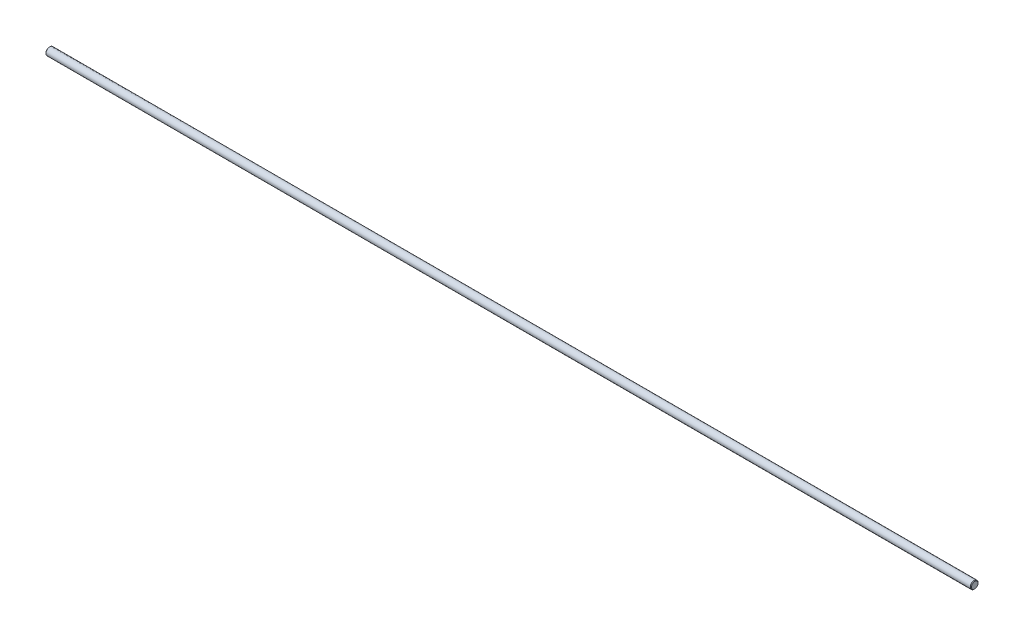
ISO-10303-21;
HEADER;
FILE_DESCRIPTION(('STEP AP214'),'2;1');
FILE_NAME('part.step','',(''),(''),'','','');
FILE_SCHEMA(('AUTOMOTIVE_DESIGN { 1 0 10303 214 1 1 1 1 }'));
ENDSEC;
DATA;
#1=APPLICATION_CONTEXT('core data for automotive mechanical design processes');
#2=APPLICATION_PROTOCOL_DEFINITION('international standard','automotive_design',2000,#1);
#3=PRODUCT_CONTEXT('',#1,'mechanical');
#4=PRODUCT('Part','Part','',(#3));
#5=PRODUCT_RELATED_PRODUCT_CATEGORY('part','',(#4));
#6=PRODUCT_DEFINITION_FORMATION('','',#4);
#7=PRODUCT_DEFINITION_CONTEXT('part definition',#1,'design');
#8=PRODUCT_DEFINITION('design','',#6,#7);
#9=PRODUCT_DEFINITION_SHAPE('','',#8);
#10=(LENGTH_UNIT() NAMED_UNIT(*) SI_UNIT(.MILLI.,.METRE.));
#11=(NAMED_UNIT(*) PLANE_ANGLE_UNIT() SI_UNIT($,.RADIAN.));
#12=(NAMED_UNIT(*) SI_UNIT($,.STERADIAN.) SOLID_ANGLE_UNIT());
#13=UNCERTAINTY_MEASURE_WITH_UNIT(LENGTH_MEASURE(1.E-05),#10,'distance_accuracy_value','');
#14=(GEOMETRIC_REPRESENTATION_CONTEXT(3) GLOBAL_UNCERTAINTY_ASSIGNED_CONTEXT((#13)) GLOBAL_UNIT_ASSIGNED_CONTEXT((#10,
#11,#12)) REPRESENTATION_CONTEXT('',''));
#15=CARTESIAN_POINT('',(0.,0.,0.));
#16=DIRECTION('',(0.,0.,1.));
#17=DIRECTION('',(1.,0.,0.));
#18=AXIS2_PLACEMENT_3D('',#15,#16,#17);
#19=CARTESIAN_POINT('',(-1524.,0.,0.));
#20=DIRECTION('',(1.,0.,0.));
#21=DIRECTION('',(0.,0.,-1.));
#22=AXIS2_PLACEMENT_3D('',#19,#20,#21);
#23=CYLINDRICAL_SURFACE('',#22,6.35);
#24=CARTESIAN_POINT('',(-1523.0475,0.,0.));
#25=DIRECTION('',(1.,0.,0.));
#26=DIRECTION('',(0.,0.,-1.));
#27=AXIS2_PLACEMENT_3D('',#24,#25,#26);
#28=CIRCLE('',#27,6.35);
#29=CARTESIAN_POINT('',(-1523.0475,0.,-6.35));
#30=VERTEX_POINT('',#29);
#31=EDGE_CURVE('E41',#30,#30,#28,.T.);
#32=ORIENTED_EDGE('',*,*,#31,.T.);
#33=EDGE_LOOP('',(#32));
#34=FACE_BOUND('',#33,.T.);
#35=CARTESIAN_POINT('',(-0.952499999999912,0.,0.));
#36=DIRECTION('',(1.,0.,0.));
#37=DIRECTION('',(0.,0.,-1.));
#38=AXIS2_PLACEMENT_3D('',#35,#36,#37);
#39=CIRCLE('',#38,6.35);
#40=CARTESIAN_POINT('',(-0.952499999999912,0.,-6.35));
#41=VERTEX_POINT('',#40);
#42=EDGE_CURVE('E45',#41,#41,#39,.F.);
#43=ORIENTED_EDGE('',*,*,#42,.T.);
#44=EDGE_LOOP('',(#43));
#45=FACE_BOUND('',#44,.T.);
#46=ADVANCED_FACE('F30',(#34,#45),#23,.T.);
#47=CARTESIAN_POINT('',(-1524.,0.,0.));
#48=DIRECTION('',(1.,0.,0.));
#49=DIRECTION('',(0.,0.,-1.));
#50=AXIS2_PLACEMENT_3D('',#47,#48,#49);
#51=PLANE('',#50);
#52=CARTESIAN_POINT('',(-1524.,0.,0.));
#53=DIRECTION('',(1.,0.,0.));
#54=DIRECTION('',(0.,0.,-1.));
#55=AXIS2_PLACEMENT_3D('',#52,#53,#54);
#56=CIRCLE('',#55,5.39749999999994);
#57=CARTESIAN_POINT('',(-1524.,0.,-5.39749999999994));
#58=VERTEX_POINT('',#57);
#59=EDGE_CURVE('E37',#58,#58,#56,.F.);
#60=ORIENTED_EDGE('',*,*,#59,.T.);
#61=EDGE_LOOP('',(#60));
#62=FACE_BOUND('',#61,.T.);
#63=ADVANCED_FACE('F61',(#62),#51,.F.);
#64=CARTESIAN_POINT('',(0.,0.,0.));
#65=DIRECTION('',(1.,0.,0.));
#66=DIRECTION('',(0.,0.,-1.));
#67=AXIS2_PLACEMENT_3D('',#64,#65,#66);
#68=PLANE('',#67);
#69=CARTESIAN_POINT('',(0.,0.,0.));
#70=DIRECTION('',(1.,0.,0.));
#71=DIRECTION('',(0.,0.,-1.));
#72=AXIS2_PLACEMENT_3D('',#69,#70,#71);
#73=CIRCLE('',#72,5.39750000000017);
#74=CARTESIAN_POINT('',(0.,0.,-5.39750000000017));
#75=VERTEX_POINT('',#74);
#76=EDGE_CURVE('E10',#75,#75,#73,.T.);
#77=ORIENTED_EDGE('',*,*,#76,.T.);
#78=EDGE_LOOP('',(#77));
#79=FACE_BOUND('',#78,.T.);
#80=ADVANCED_FACE('F58',(#79),#68,.T.);
#81=CARTESIAN_POINT('',(-1523.0475,0.,0.));
#82=DIRECTION('',(1.,0.,0.));
#83=DIRECTION('',(0.,0.,-1.));
#84=AXIS2_PLACEMENT_3D('',#81,#82,#83);
#85=CONICAL_SURFACE('',#84,6.35,0.785398163397291);
#86=ORIENTED_EDGE('',*,*,#59,.F.);
#87=EDGE_LOOP('',(#86));
#88=FACE_BOUND('',#87,.T.);
#89=ORIENTED_EDGE('',*,*,#31,.F.);
#90=EDGE_LOOP('',(#89));
#91=FACE_BOUND('',#90,.T.);
#92=ADVANCED_FACE('F54',(#88,#91),#85,.T.);
#93=CARTESIAN_POINT('',(0.,0.,0.));
#94=DIRECTION('',(-1.,0.,0.));
#95=DIRECTION('',(0.,0.,1.));
#96=AXIS2_PLACEMENT_3D('',#93,#94,#95);
#97=CONICAL_SURFACE('',#96,5.39750000000017,0.785398163397407);
#98=ORIENTED_EDGE('',*,*,#42,.F.);
#99=EDGE_LOOP('',(#98));
#100=FACE_BOUND('',#99,.T.);
#101=ORIENTED_EDGE('',*,*,#76,.F.);
#102=EDGE_LOOP('',(#101));
#103=FACE_BOUND('',#102,.T.);
#104=ADVANCED_FACE('F32',(#100,#103),#97,.T.);
#105=CLOSED_SHELL('',(#46,#63,#80,#92,#104));
#106=MANIFOLD_SOLID_BREP('B2',#105);
#107=ADVANCED_BREP_SHAPE_REPRESENTATION('',(#18,#106),#14);
#108=SHAPE_DEFINITION_REPRESENTATION(#9,#107);
ENDSEC;
END-ISO-10303-21;
